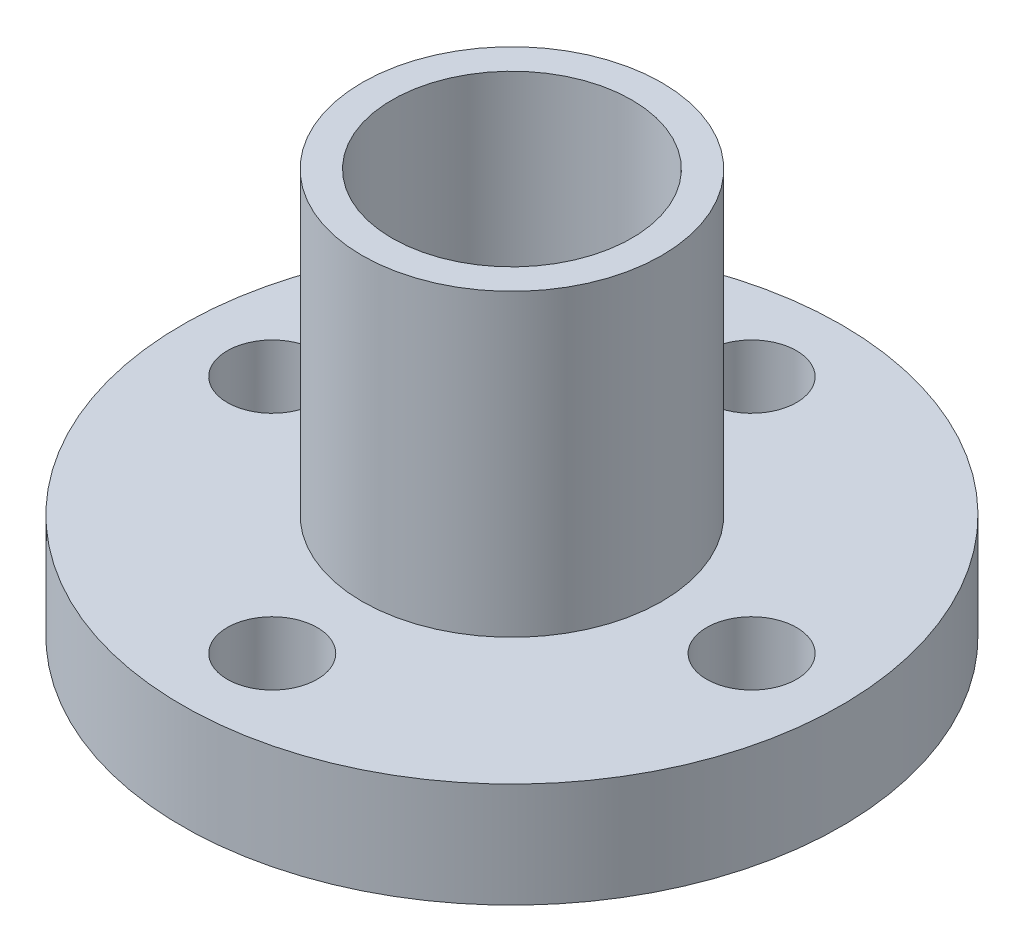
ISO-10303-21;
HEADER;
FILE_DESCRIPTION(('STEP AP214'),'2;1');
FILE_NAME('part.step','',(''),(''),'','','');
FILE_SCHEMA(('AUTOMOTIVE_DESIGN { 1 0 10303 214 1 1 1 1 }'));
ENDSEC;
DATA;
#1=APPLICATION_CONTEXT('core data for automotive mechanical design processes');
#2=APPLICATION_PROTOCOL_DEFINITION('international standard','automotive_design',2000,#1);
#3=PRODUCT_CONTEXT('',#1,'mechanical');
#4=PRODUCT('Part','Part','',(#3));
#5=PRODUCT_RELATED_PRODUCT_CATEGORY('part','',(#4));
#6=PRODUCT_DEFINITION_FORMATION('','',#4);
#7=PRODUCT_DEFINITION_CONTEXT('part definition',#1,'design');
#8=PRODUCT_DEFINITION('design','',#6,#7);
#9=PRODUCT_DEFINITION_SHAPE('','',#8);
#10=(LENGTH_UNIT() NAMED_UNIT(*) SI_UNIT(.MILLI.,.METRE.));
#11=(NAMED_UNIT(*) PLANE_ANGLE_UNIT() SI_UNIT($,.RADIAN.));
#12=(NAMED_UNIT(*) SI_UNIT($,.STERADIAN.) SOLID_ANGLE_UNIT());
#13=UNCERTAINTY_MEASURE_WITH_UNIT(LENGTH_MEASURE(1.E-05),#10,'distance_accuracy_value','');
#14=(GEOMETRIC_REPRESENTATION_CONTEXT(3) GLOBAL_UNCERTAINTY_ASSIGNED_CONTEXT((#13)) GLOBAL_UNIT_ASSIGNED_CONTEXT((#10,
#11,#12)) REPRESENTATION_CONTEXT('',''));
#15=CARTESIAN_POINT('',(0.,0.,0.));
#16=DIRECTION('',(0.,0.,1.));
#17=DIRECTION('',(1.,0.,0.));
#18=AXIS2_PLACEMENT_3D('',#15,#16,#17);
#19=CARTESIAN_POINT('',(5.,0.,0.));
#20=DIRECTION('',(0.,-1.,0.));
#21=DIRECTION('',(0.,0.,-1.));
#22=AXIS2_PLACEMENT_3D('',#19,#20,#21);
#23=PLANE('',#22);
#24=CARTESIAN_POINT('',(0.,0.,0.));
#25=DIRECTION('',(0.,-1.,0.));
#26=DIRECTION('',(0.,0.,-1.));
#27=AXIS2_PLACEMENT_3D('',#24,#25,#26);
#28=CIRCLE('',#27,5.);
#29=CARTESIAN_POINT('',(0.,0.,-5.));
#30=VERTEX_POINT('',#29);
#31=EDGE_CURVE('E64',#30,#30,#28,.T.);
#32=ORIENTED_EDGE('',*,*,#31,.T.);
#33=EDGE_LOOP('',(#32));
#34=FACE_BOUND('',#33,.T.);
#35=CARTESIAN_POINT('',(0.,0.,0.));
#36=DIRECTION('',(0.,-1.,0.));
#37=DIRECTION('',(0.,0.,-1.));
#38=AXIS2_PLACEMENT_3D('',#35,#36,#37);
#39=CIRCLE('',#38,4.);
#40=CARTESIAN_POINT('',(0.,0.,-4.));
#41=VERTEX_POINT('',#40);
#42=EDGE_CURVE('E10',#41,#41,#39,.T.);
#43=ORIENTED_EDGE('',*,*,#42,.F.);
#44=EDGE_LOOP('',(#43));
#45=FACE_BOUND('',#44,.T.);
#46=ADVANCED_FACE('F37',(#34,#45),#23,.T.);
#47=CARTESIAN_POINT('',(0.,-4.16666666666667,0.));
#48=DIRECTION('',(0.,-1.,0.));
#49=DIRECTION('',(0.,0.,-1.));
#50=AXIS2_PLACEMENT_3D('',#47,#48,#49);
#51=CYLINDRICAL_SURFACE('',#50,4.);
#52=ORIENTED_EDGE('',*,*,#42,.T.);
#53=EDGE_LOOP('',(#52));
#54=FACE_BOUND('',#53,.T.);
#55=CARTESIAN_POINT('',(0.,15.5,0.));
#56=DIRECTION('',(0.,-1.,0.));
#57=DIRECTION('',(0.,0.,-1.));
#58=AXIS2_PLACEMENT_3D('',#55,#56,#57);
#59=CIRCLE('',#58,4.);
#60=CARTESIAN_POINT('',(0.,15.5,-4.));
#61=VERTEX_POINT('',#60);
#62=EDGE_CURVE('E44',#61,#61,#59,.T.);
#63=ORIENTED_EDGE('',*,*,#62,.F.);
#64=EDGE_LOOP('',(#63));
#65=FACE_BOUND('',#64,.T.);
#66=ADVANCED_FACE('F94',(#54,#65),#51,.F.);
#67=CARTESIAN_POINT('',(4.,15.5,0.));
#68=DIRECTION('',(0.,1.,0.));
#69=DIRECTION('',(0.,0.,1.));
#70=AXIS2_PLACEMENT_3D('',#67,#68,#69);
#71=PLANE('',#70);
#72=ORIENTED_EDGE('',*,*,#62,.T.);
#73=EDGE_LOOP('',(#72));
#74=FACE_BOUND('',#73,.T.);
#75=CARTESIAN_POINT('',(0.,15.5,0.));
#76=DIRECTION('',(0.,-1.,0.));
#77=DIRECTION('',(0.,0.,-1.));
#78=AXIS2_PLACEMENT_3D('',#75,#76,#77);
#79=CIRCLE('',#78,5.);
#80=CARTESIAN_POINT('',(0.,15.5,-5.));
#81=VERTEX_POINT('',#80);
#82=EDGE_CURVE('E49',#81,#81,#79,.T.);
#83=ORIENTED_EDGE('',*,*,#82,.F.);
#84=EDGE_LOOP('',(#83));
#85=FACE_BOUND('',#84,.T.);
#86=ADVANCED_FACE('F92',(#74,#85),#71,.T.);
#87=CARTESIAN_POINT('',(0.,-4.16666666666667,0.));
#88=DIRECTION('',(0.,-1.,0.));
#89=DIRECTION('',(0.,0.,-1.));
#90=AXIS2_PLACEMENT_3D('',#87,#88,#89);
#91=CYLINDRICAL_SURFACE('',#90,5.);
#92=ORIENTED_EDGE('',*,*,#82,.T.);
#93=EDGE_LOOP('',(#92));
#94=FACE_BOUND('',#93,.T.);
#95=CARTESIAN_POINT('',(0.,5.5,0.));
#96=DIRECTION('',(0.,-1.,0.));
#97=DIRECTION('',(0.,0.,-1.));
#98=AXIS2_PLACEMENT_3D('',#95,#96,#97);
#99=CIRCLE('',#98,5.);
#100=CARTESIAN_POINT('',(0.,5.5,-5.));
#101=VERTEX_POINT('',#100);
#102=EDGE_CURVE('E84',#101,#101,#99,.T.);
#103=ORIENTED_EDGE('',*,*,#102,.F.);
#104=EDGE_LOOP('',(#103));
#105=FACE_BOUND('',#104,.T.);
#106=ADVANCED_FACE('F89',(#94,#105),#91,.T.);
#107=CARTESIAN_POINT('',(5.,5.5,0.));
#108=DIRECTION('',(0.,1.,0.));
#109=DIRECTION('',(0.,0.,1.));
#110=AXIS2_PLACEMENT_3D('',#107,#108,#109);
#111=PLANE('',#110);
#112=CARTESIAN_POINT('',(0.,5.5,-8.));
#113=DIRECTION('',(0.,1.,0.));
#114=DIRECTION('',(0.,0.,1.));
#115=AXIS2_PLACEMENT_3D('',#112,#113,#114);
#116=CIRCLE('',#115,1.5);
#117=CARTESIAN_POINT('',(0.,5.5,-6.5));
#118=VERTEX_POINT('',#117);
#119=EDGE_CURVE('E57',#118,#118,#116,.T.);
#120=ORIENTED_EDGE('',*,*,#119,.F.);
#121=EDGE_LOOP('',(#120));
#122=FACE_BOUND('',#121,.T.);
#123=CARTESIAN_POINT('',(8.,5.5,0.));
#124=DIRECTION('',(0.,1.,0.));
#125=DIRECTION('',(0.,0.,1.));
#126=AXIS2_PLACEMENT_3D('',#123,#124,#125);
#127=CIRCLE('',#126,1.5);
#128=CARTESIAN_POINT('',(8.,5.5,1.5));
#129=VERTEX_POINT('',#128);
#130=EDGE_CURVE('E220',#129,#129,#127,.T.);
#131=ORIENTED_EDGE('',*,*,#130,.F.);
#132=EDGE_LOOP('',(#131));
#133=FACE_BOUND('',#132,.T.);
#134=CARTESIAN_POINT('',(0.,5.5,8.));
#135=DIRECTION('',(0.,1.,0.));
#136=DIRECTION('',(0.,0.,1.));
#137=AXIS2_PLACEMENT_3D('',#134,#135,#136);
#138=CIRCLE('',#137,1.5);
#139=CARTESIAN_POINT('',(0.,5.5,9.5));
#140=VERTEX_POINT('',#139);
#141=EDGE_CURVE('E223',#140,#140,#138,.T.);
#142=ORIENTED_EDGE('',*,*,#141,.F.);
#143=EDGE_LOOP('',(#142));
#144=FACE_BOUND('',#143,.T.);
#145=CARTESIAN_POINT('',(-8.,5.5,0.));
#146=DIRECTION('',(0.,1.,0.));
#147=DIRECTION('',(0.,0.,1.));
#148=AXIS2_PLACEMENT_3D('',#145,#146,#147);
#149=CIRCLE('',#148,1.5);
#150=CARTESIAN_POINT('',(-8.,5.5,1.5));
#151=VERTEX_POINT('',#150);
#152=EDGE_CURVE('E76',#151,#151,#149,.T.);
#153=ORIENTED_EDGE('',*,*,#152,.F.);
#154=EDGE_LOOP('',(#153));
#155=FACE_BOUND('',#154,.T.);
#156=ORIENTED_EDGE('',*,*,#102,.T.);
#157=EDGE_LOOP('',(#156));
#158=FACE_BOUND('',#157,.T.);
#159=CARTESIAN_POINT('',(0.,5.5,0.));
#160=DIRECTION('',(0.,-1.,0.));
#161=DIRECTION('',(0.,0.,-1.));
#162=AXIS2_PLACEMENT_3D('',#159,#160,#161);
#163=CIRCLE('',#162,11.);
#164=CARTESIAN_POINT('',(0.,5.5,-11.));
#165=VERTEX_POINT('',#164);
#166=EDGE_CURVE('E81',#165,#165,#163,.T.);
#167=ORIENTED_EDGE('',*,*,#166,.F.);
#168=EDGE_LOOP('',(#167));
#169=FACE_BOUND('',#168,.T.);
#170=ADVANCED_FACE('F101',(#122,#133,#144,#155,#158,#169),#111,.T.);
#171=CARTESIAN_POINT('',(0.,-4.16666666666667,0.));
#172=DIRECTION('',(0.,-1.,0.));
#173=DIRECTION('',(0.,0.,-1.));
#174=AXIS2_PLACEMENT_3D('',#171,#172,#173);
#175=CYLINDRICAL_SURFACE('',#174,11.);
#176=ORIENTED_EDGE('',*,*,#166,.T.);
#177=EDGE_LOOP('',(#176));
#178=FACE_BOUND('',#177,.T.);
#179=CARTESIAN_POINT('',(0.,2.,0.));
#180=DIRECTION('',(0.,-1.,0.));
#181=DIRECTION('',(0.,0.,-1.));
#182=AXIS2_PLACEMENT_3D('',#179,#180,#181);
#183=CIRCLE('',#182,11.);
#184=CARTESIAN_POINT('',(0.,2.,-11.));
#185=VERTEX_POINT('',#184);
#186=EDGE_CURVE('E73',#185,#185,#183,.T.);
#187=ORIENTED_EDGE('',*,*,#186,.F.);
#188=EDGE_LOOP('',(#187));
#189=FACE_BOUND('',#188,.T.);
#190=ADVANCED_FACE('F143',(#178,#189),#175,.T.);
#191=CARTESIAN_POINT('',(11.,2.,0.));
#192=DIRECTION('',(0.,-1.,0.));
#193=DIRECTION('',(0.,0.,-1.));
#194=AXIS2_PLACEMENT_3D('',#191,#192,#193);
#195=PLANE('',#194);
#196=CARTESIAN_POINT('',(0.,2.,-8.));
#197=DIRECTION('',(0.,-1.,0.));
#198=DIRECTION('',(0.,0.,-1.));
#199=AXIS2_PLACEMENT_3D('',#196,#197,#198);
#200=CIRCLE('',#199,1.5);
#201=CARTESIAN_POINT('',(0.,2.,-9.5));
#202=VERTEX_POINT('',#201);
#203=EDGE_CURVE('E40',#202,#202,#200,.T.);
#204=ORIENTED_EDGE('',*,*,#203,.F.);
#205=EDGE_LOOP('',(#204));
#206=FACE_BOUND('',#205,.T.);
#207=CARTESIAN_POINT('',(8.,2.,0.));
#208=DIRECTION('',(0.,-1.,0.));
#209=DIRECTION('',(0.,0.,-1.));
#210=AXIS2_PLACEMENT_3D('',#207,#208,#209);
#211=CIRCLE('',#210,1.5);
#212=CARTESIAN_POINT('',(8.,2.,-1.5));
#213=VERTEX_POINT('',#212);
#214=EDGE_CURVE('E59',#213,#213,#211,.T.);
#215=ORIENTED_EDGE('',*,*,#214,.F.);
#216=EDGE_LOOP('',(#215));
#217=FACE_BOUND('',#216,.T.);
#218=CARTESIAN_POINT('',(0.,2.,8.));
#219=DIRECTION('',(0.,-1.,0.));
#220=DIRECTION('',(0.,0.,-1.));
#221=AXIS2_PLACEMENT_3D('',#218,#219,#220);
#222=CIRCLE('',#221,1.5);
#223=CARTESIAN_POINT('',(0.,2.,6.5));
#224=VERTEX_POINT('',#223);
#225=EDGE_CURVE('E56',#224,#224,#222,.T.);
#226=ORIENTED_EDGE('',*,*,#225,.F.);
#227=EDGE_LOOP('',(#226));
#228=FACE_BOUND('',#227,.T.);
#229=CARTESIAN_POINT('',(-8.,2.,0.));
#230=DIRECTION('',(0.,-1.,0.));
#231=DIRECTION('',(0.,0.,-1.));
#232=AXIS2_PLACEMENT_3D('',#229,#230,#231);
#233=CIRCLE('',#232,1.5);
#234=CARTESIAN_POINT('',(-8.,2.,-1.5));
#235=VERTEX_POINT('',#234);
#236=EDGE_CURVE('E53',#235,#235,#233,.T.);
#237=ORIENTED_EDGE('',*,*,#236,.F.);
#238=EDGE_LOOP('',(#237));
#239=FACE_BOUND('',#238,.T.);
#240=ORIENTED_EDGE('',*,*,#186,.T.);
#241=EDGE_LOOP('',(#240));
#242=FACE_BOUND('',#241,.T.);
#243=CARTESIAN_POINT('',(0.,2.,0.));
#244=DIRECTION('',(0.,-1.,0.));
#245=DIRECTION('',(0.,0.,-1.));
#246=AXIS2_PLACEMENT_3D('',#243,#244,#245);
#247=CIRCLE('',#246,5.);
#248=CARTESIAN_POINT('',(0.,2.,-5.));
#249=VERTEX_POINT('',#248);
#250=EDGE_CURVE('E68',#249,#249,#247,.T.);
#251=ORIENTED_EDGE('',*,*,#250,.F.);
#252=EDGE_LOOP('',(#251));
#253=FACE_BOUND('',#252,.T.);
#254=ADVANCED_FACE('F148',(#206,#217,#228,#239,#242,#253),#195,.T.);
#255=CARTESIAN_POINT('',(0.,-4.16666666666667,0.));
#256=DIRECTION('',(0.,-1.,0.));
#257=DIRECTION('',(0.,0.,-1.));
#258=AXIS2_PLACEMENT_3D('',#255,#256,#257);
#259=CYLINDRICAL_SURFACE('',#258,5.);
#260=ORIENTED_EDGE('',*,*,#250,.T.);
#261=EDGE_LOOP('',(#260));
#262=FACE_BOUND('',#261,.T.);
#263=ORIENTED_EDGE('',*,*,#31,.F.);
#264=EDGE_LOOP('',(#263));
#265=FACE_BOUND('',#264,.T.);
#266=ADVANCED_FACE('F156',(#262,#265),#259,.T.);
#267=CARTESIAN_POINT('',(-8.,0.,0.));
#268=DIRECTION('',(0.,1.,0.));
#269=DIRECTION('',(0.,0.,1.));
#270=AXIS2_PLACEMENT_3D('',#267,#268,#269);
#271=CYLINDRICAL_SURFACE('',#270,1.5);
#272=ORIENTED_EDGE('',*,*,#236,.T.);
#273=EDGE_LOOP('',(#272));
#274=FACE_BOUND('',#273,.T.);
#275=ORIENTED_EDGE('',*,*,#152,.T.);
#276=EDGE_LOOP('',(#275));
#277=FACE_BOUND('',#276,.T.);
#278=ADVANCED_FACE('F161',(#274,#277),#271,.F.);
#279=CARTESIAN_POINT('',(0.,0.,8.));
#280=DIRECTION('',(0.,1.,0.));
#281=DIRECTION('',(0.,0.,1.));
#282=AXIS2_PLACEMENT_3D('',#279,#280,#281);
#283=CYLINDRICAL_SURFACE('',#282,1.5);
#284=ORIENTED_EDGE('',*,*,#225,.T.);
#285=EDGE_LOOP('',(#284));
#286=FACE_BOUND('',#285,.T.);
#287=ORIENTED_EDGE('',*,*,#141,.T.);
#288=EDGE_LOOP('',(#287));
#289=FACE_BOUND('',#288,.T.);
#290=ADVANCED_FACE('F185',(#286,#289),#283,.F.);
#291=CARTESIAN_POINT('',(8.,0.,0.));
#292=DIRECTION('',(0.,1.,0.));
#293=DIRECTION('',(0.,0.,1.));
#294=AXIS2_PLACEMENT_3D('',#291,#292,#293);
#295=CYLINDRICAL_SURFACE('',#294,1.5);
#296=ORIENTED_EDGE('',*,*,#214,.T.);
#297=EDGE_LOOP('',(#296));
#298=FACE_BOUND('',#297,.T.);
#299=ORIENTED_EDGE('',*,*,#130,.T.);
#300=EDGE_LOOP('',(#299));
#301=FACE_BOUND('',#300,.T.);
#302=ADVANCED_FACE('F195',(#298,#301),#295,.F.);
#303=CARTESIAN_POINT('',(0.,0.,-8.));
#304=DIRECTION('',(0.,1.,0.));
#305=DIRECTION('',(0.,0.,1.));
#306=AXIS2_PLACEMENT_3D('',#303,#304,#305);
#307=CYLINDRICAL_SURFACE('',#306,1.5);
#308=ORIENTED_EDGE('',*,*,#203,.T.);
#309=EDGE_LOOP('',(#308));
#310=FACE_BOUND('',#309,.T.);
#311=ORIENTED_EDGE('',*,*,#119,.T.);
#312=EDGE_LOOP('',(#311));
#313=FACE_BOUND('',#312,.T.);
#314=ADVANCED_FACE('F205',(#310,#313),#307,.F.);
#315=CLOSED_SHELL('',(#46,#66,#86,#106,#170,#190,#254,#266,#278,#290,#302,#314));
#316=MANIFOLD_SOLID_BREP('B2',#315);
#317=ADVANCED_BREP_SHAPE_REPRESENTATION('',(#18,#316),#14);
#318=SHAPE_DEFINITION_REPRESENTATION(#9,#317);
ENDSEC;
END-ISO-10303-21;
